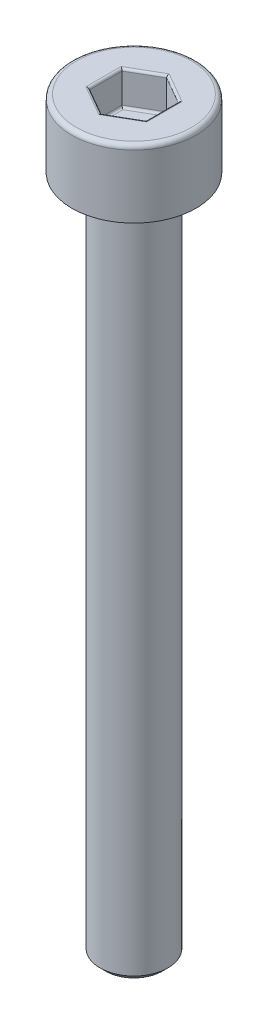
ISO-10303-21;
HEADER;
FILE_DESCRIPTION(('STEP AP214'),'2;1');
FILE_NAME('part.step','',(''),(''),'','','');
FILE_SCHEMA(('AUTOMOTIVE_DESIGN { 1 0 10303 214 1 1 1 1 }'));
ENDSEC;
DATA;
#1=APPLICATION_CONTEXT('core data for automotive mechanical design processes');
#2=APPLICATION_PROTOCOL_DEFINITION('international standard','automotive_design',2000,#1);
#3=PRODUCT_CONTEXT('',#1,'mechanical');
#4=PRODUCT('Part','Part','',(#3));
#5=PRODUCT_RELATED_PRODUCT_CATEGORY('part','',(#4));
#6=PRODUCT_DEFINITION_FORMATION('','',#4);
#7=PRODUCT_DEFINITION_CONTEXT('part definition',#1,'design');
#8=PRODUCT_DEFINITION('design','',#6,#7);
#9=PRODUCT_DEFINITION_SHAPE('','',#8);
#10=(LENGTH_UNIT() NAMED_UNIT(*) SI_UNIT(.MILLI.,.METRE.));
#11=(NAMED_UNIT(*) PLANE_ANGLE_UNIT() SI_UNIT($,.RADIAN.));
#12=(NAMED_UNIT(*) SI_UNIT($,.STERADIAN.) SOLID_ANGLE_UNIT());
#13=UNCERTAINTY_MEASURE_WITH_UNIT(LENGTH_MEASURE(1.E-05),#10,'distance_accuracy_value','');
#14=(GEOMETRIC_REPRESENTATION_CONTEXT(3) GLOBAL_UNCERTAINTY_ASSIGNED_CONTEXT((#13)) GLOBAL_UNIT_ASSIGNED_CONTEXT((#10,
#11,#12)) REPRESENTATION_CONTEXT('',''));
#15=CARTESIAN_POINT('',(0.,0.,0.));
#16=DIRECTION('',(0.,0.,1.));
#17=DIRECTION('',(1.,0.,0.));
#18=AXIS2_PLACEMENT_3D('',#15,#16,#17);
#19=CARTESIAN_POINT('',(0.,-33.,0.));
#20=DIRECTION('',(0.,-1.,0.));
#21=DIRECTION('',(0.,0.,-1.));
#22=AXIS2_PLACEMENT_3D('',#19,#20,#21);
#23=PLANE('',#22);
#24=CARTESIAN_POINT('',(0.,-33.,0.));
#25=DIRECTION('',(0.,-1.,0.));
#26=DIRECTION('',(0.,0.,-1.));
#27=AXIS2_PLACEMENT_3D('',#24,#25,#26);
#28=CIRCLE('',#27,1.25);
#29=CARTESIAN_POINT('',(0.,-33.,-1.25));
#30=VERTEX_POINT('',#29);
#31=EDGE_CURVE('E264',#30,#30,#28,.T.);
#32=ORIENTED_EDGE('',*,*,#31,.T.);
#33=EDGE_LOOP('',(#32));
#34=FACE_BOUND('',#33,.T.);
#35=ADVANCED_FACE('F36',(#34),#23,.T.);
#36=CARTESIAN_POINT('',(0.,0.,0.));
#37=DIRECTION('',(0.,1.,0.));
#38=DIRECTION('',(0.,0.,1.));
#39=AXIS2_PLACEMENT_3D('',#36,#37,#38);
#40=CYLINDRICAL_SURFACE('',#39,1.5);
#41=CARTESIAN_POINT('',(0.,-3.25,0.));
#42=DIRECTION('',(0.,-1.,0.));
#43=DIRECTION('',(0.,0.,-1.));
#44=AXIS2_PLACEMENT_3D('',#41,#42,#43);
#45=CIRCLE('',#44,1.5);
#46=CARTESIAN_POINT('',(0.,-3.25,-1.5));
#47=VERTEX_POINT('',#46);
#48=EDGE_CURVE('E261',#47,#47,#45,.T.);
#49=ORIENTED_EDGE('',*,*,#48,.T.);
#50=EDGE_LOOP('',(#49));
#51=FACE_BOUND('',#50,.T.);
#52=CARTESIAN_POINT('',(0.,-32.75,0.));
#53=DIRECTION('',(0.,-1.,0.));
#54=DIRECTION('',(0.,0.,-1.));
#55=AXIS2_PLACEMENT_3D('',#52,#53,#54);
#56=CIRCLE('',#55,1.5);
#57=CARTESIAN_POINT('',(0.,-32.75,-1.5));
#58=VERTEX_POINT('',#57);
#59=EDGE_CURVE('E258',#58,#58,#56,.F.);
#60=ORIENTED_EDGE('',*,*,#59,.T.);
#61=EDGE_LOOP('',(#60));
#62=FACE_BOUND('',#61,.T.);
#63=ADVANCED_FACE('F290',(#51,#62),#40,.T.);
#64=CARTESIAN_POINT('',(-1.5,-3.,0.));
#65=DIRECTION('',(0.,-1.,0.));
#66=DIRECTION('',(0.,0.,-1.));
#67=AXIS2_PLACEMENT_3D('',#64,#65,#66);
#68=PLANE('',#67);
#69=CARTESIAN_POINT('',(0.,-3.,0.));
#70=DIRECTION('',(0.,-1.,0.));
#71=DIRECTION('',(0.,0.,-1.));
#72=AXIS2_PLACEMENT_3D('',#69,#70,#71);
#73=CIRCLE('',#72,1.74999999999999);
#74=CARTESIAN_POINT('',(0.,-3.,-1.74999999999999));
#75=VERTEX_POINT('',#74);
#76=EDGE_CURVE('E255',#75,#75,#73,.F.);
#77=ORIENTED_EDGE('',*,*,#76,.T.);
#78=EDGE_LOOP('',(#77));
#79=FACE_BOUND('',#78,.T.);
#80=CARTESIAN_POINT('',(0.,-3.,0.));
#81=DIRECTION('',(0.,1.,0.));
#82=DIRECTION('',(0.,0.,1.));
#83=AXIS2_PLACEMENT_3D('',#80,#81,#82);
#84=CIRCLE('',#83,2.75);
#85=CARTESIAN_POINT('',(0.,-3.,2.75));
#86=VERTEX_POINT('',#85);
#87=EDGE_CURVE('E252',#86,#86,#84,.T.);
#88=ORIENTED_EDGE('',*,*,#87,.F.);
#89=EDGE_LOOP('',(#88));
#90=FACE_BOUND('',#89,.T.);
#91=ADVANCED_FACE('F296',(#79,#90),#68,.T.);
#92=CARTESIAN_POINT('',(0.,0.,0.));
#93=DIRECTION('',(0.,1.,0.));
#94=DIRECTION('',(0.,0.,1.));
#95=AXIS2_PLACEMENT_3D('',#92,#93,#94);
#96=CYLINDRICAL_SURFACE('',#95,2.75);
#97=CARTESIAN_POINT('',(0.,-0.2,0.));
#98=DIRECTION('',(0.,1.,0.));
#99=DIRECTION('',(0.,0.,1.));
#100=AXIS2_PLACEMENT_3D('',#97,#98,#99);
#101=CIRCLE('',#100,2.75);
#102=CARTESIAN_POINT('',(0.,-0.2,2.75));
#103=VERTEX_POINT('',#102);
#104=EDGE_CURVE('E162',#103,#103,#101,.F.);
#105=ORIENTED_EDGE('',*,*,#104,.T.);
#106=EDGE_LOOP('',(#105));
#107=FACE_BOUND('',#106,.T.);
#108=ORIENTED_EDGE('',*,*,#87,.T.);
#109=EDGE_LOOP('',(#108));
#110=FACE_BOUND('',#109,.T.);
#111=ADVANCED_FACE('F306',(#107,#110),#96,.T.);
#112=CARTESIAN_POINT('',(-2.75,0.,0.));
#113=DIRECTION('',(0.,1.,0.));
#114=DIRECTION('',(0.,0.,1.));
#115=AXIS2_PLACEMENT_3D('',#112,#113,#114);
#116=PLANE('',#115);
#117=DIRECTION('',(0.,0.,1.));
#118=VECTOR('',#117,1.);
#119=CARTESIAN_POINT('',(-1.35,0.,-0.721687836487034));
#120=LINE('',#119,#118);
#121=CARTESIAN_POINT('',(-1.35,0.,0.779422863405994));
#122=VERTEX_POINT('',#121);
#123=CARTESIAN_POINT('',(-1.35,0.,-0.779422863405996));
#124=VERTEX_POINT('',#123);
#125=EDGE_CURVE('E178',#122,#124,#120,.F.);
#126=ORIENTED_EDGE('',*,*,#125,.T.);
#127=DIRECTION('',(-0.866025403784439,0.,0.5));
#128=VECTOR('',#127,1.);
#129=CARTESIAN_POINT('',(-0.0500000000000009,0.,-1.52997821335251));
#130=LINE('',#129,#128);
#131=CARTESIAN_POINT('',(0.,0.,-1.55884572681199));
#132=VERTEX_POINT('',#131);
#133=EDGE_CURVE('E137',#124,#132,#130,.F.);
#134=ORIENTED_EDGE('',*,*,#133,.T.);
#135=DIRECTION('',(-0.866025403784439,0.,-0.5));
#136=VECTOR('',#135,1.);
#137=CARTESIAN_POINT('',(1.3,0.,-0.808290376865478));
#138=LINE('',#137,#136);
#139=CARTESIAN_POINT('',(1.35,0.,-0.779422863405996));
#140=VERTEX_POINT('',#139);
#141=EDGE_CURVE('E164',#132,#140,#138,.F.);
#142=ORIENTED_EDGE('',*,*,#141,.T.);
#143=DIRECTION('',(0.,0.,-1.));
#144=VECTOR('',#143,1.);
#145=CARTESIAN_POINT('',(1.35,0.,0.721687836487032));
#146=LINE('',#145,#144);
#147=CARTESIAN_POINT('',(1.35,0.,0.779422863405995));
#148=VERTEX_POINT('',#147);
#149=EDGE_CURVE('E172',#140,#148,#146,.F.);
#150=ORIENTED_EDGE('',*,*,#149,.T.);
#151=DIRECTION('',(0.866025403784439,0.,-0.5));
#152=VECTOR('',#151,1.);
#153=CARTESIAN_POINT('',(0.0499999999999991,0.,1.52997821335251));
#154=LINE('',#153,#152);
#155=CARTESIAN_POINT('',(0.,0.,1.55884572681199));
#156=VERTEX_POINT('',#155);
#157=EDGE_CURVE('E174',#148,#156,#154,.F.);
#158=ORIENTED_EDGE('',*,*,#157,.T.);
#159=DIRECTION('',(0.866025403784439,0.,0.5));
#160=VECTOR('',#159,1.);
#161=CARTESIAN_POINT('',(-1.3,0.,0.808290376865476));
#162=LINE('',#161,#160);
#163=EDGE_CURVE('E176',#156,#122,#162,.F.);
#164=ORIENTED_EDGE('',*,*,#163,.T.);
#165=EDGE_LOOP('',(#126,#134,#142,#150,#158,#164));
#166=FACE_BOUND('',#165,.T.);
#167=CARTESIAN_POINT('',(0.,0.,0.));
#168=DIRECTION('',(0.,1.,0.));
#169=DIRECTION('',(0.,0.,1.));
#170=AXIS2_PLACEMENT_3D('',#167,#168,#169);
#171=CIRCLE('',#170,2.55);
#172=CARTESIAN_POINT('',(0.,0.,2.55));
#173=VERTEX_POINT('',#172);
#174=EDGE_CURVE('E167',#173,#173,#171,.T.);
#175=ORIENTED_EDGE('',*,*,#174,.T.);
#176=EDGE_LOOP('',(#175));
#177=FACE_BOUND('',#176,.T.);
#178=ADVANCED_FACE('F269',(#166,#177),#116,.T.);
#179=CARTESIAN_POINT('',(0.,-3.,0.));
#180=DIRECTION('',(0.,1.,0.));
#181=DIRECTION('',(0.,0.,1.));
#182=AXIS2_PLACEMENT_3D('',#179,#180,#181);
#183=CONICAL_SURFACE('',#182,1.74999999999999,0.785398163397452);
#184=ORIENTED_EDGE('',*,*,#48,.F.);
#185=EDGE_LOOP('',(#184));
#186=FACE_BOUND('',#185,.T.);
#187=ORIENTED_EDGE('',*,*,#76,.F.);
#188=EDGE_LOOP('',(#187));
#189=FACE_BOUND('',#188,.T.);
#190=ADVANCED_FACE('F284',(#186,#189),#183,.T.);
#191=CARTESIAN_POINT('',(0.,-32.75,0.));
#192=DIRECTION('',(0.,1.,0.));
#193=DIRECTION('',(0.,0.,1.));
#194=AXIS2_PLACEMENT_3D('',#191,#192,#193);
#195=CONICAL_SURFACE('',#194,1.5,0.785398163397443);
#196=ORIENTED_EDGE('',*,*,#31,.F.);
#197=EDGE_LOOP('',(#196));
#198=FACE_BOUND('',#197,.T.);
#199=ORIENTED_EDGE('',*,*,#59,.F.);
#200=EDGE_LOOP('',(#199));
#201=FACE_BOUND('',#200,.T.);
#202=ADVANCED_FACE('F274',(#198,#201),#195,.T.);
#203=CARTESIAN_POINT('',(0.,-0.2,0.));
#204=DIRECTION('',(0.,1.,0.));
#205=DIRECTION('',(0.,0.,1.));
#206=AXIS2_PLACEMENT_3D('',#203,#204,#205);
#207=TOROIDAL_SURFACE('',#206,2.55,0.2);
#208=ORIENTED_EDGE('',*,*,#104,.F.);
#209=EDGE_LOOP('',(#208));
#210=FACE_BOUND('',#209,.T.);
#211=ORIENTED_EDGE('',*,*,#174,.F.);
#212=EDGE_LOOP('',(#211));
#213=FACE_BOUND('',#212,.T.);
#214=ADVANCED_FACE('F271',(#210,#213),#207,.T.);
#215=CARTESIAN_POINT('',(1.25,-1.5,-0.721687836487034));
#216=DIRECTION('',(0.5,0.,-0.866025403784439));
#217=DIRECTION('',(-0.866025403784439,0.,-0.5));
#218=AXIS2_PLACEMENT_3D('',#215,#216,#217);
#219=PLANE('',#218);
#220=DIRECTION('',(0.,1.,0.));
#221=VECTOR('',#220,1.);
#222=CARTESIAN_POINT('',(1.25,-1.5,-0.721687836487034));
#223=LINE('',#222,#221);
#224=CARTESIAN_POINT('',(1.25,-1.4,-0.721687836487034));
#225=VERTEX_POINT('',#224);
#226=CARTESIAN_POINT('',(1.25,-0.1,-0.721687836487034));
#227=VERTEX_POINT('',#226);
#228=EDGE_CURVE('E246',#225,#227,#223,.T.);
#229=ORIENTED_EDGE('',*,*,#228,.T.);
#230=DIRECTION('',(-0.866025403784439,0.,-0.5));
#231=VECTOR('',#230,1.);
#232=CARTESIAN_POINT('',(0.,-0.1,-1.44337567297407));
#233=LINE('',#232,#231);
#234=CARTESIAN_POINT('',(0.,-0.1,-1.44337567297407));
#235=VERTEX_POINT('',#234);
#236=EDGE_CURVE('E198',#227,#235,#233,.T.);
#237=ORIENTED_EDGE('',*,*,#236,.T.);
#238=DIRECTION('',(0.,1.,0.));
#239=VECTOR('',#238,1.);
#240=CARTESIAN_POINT('',(0.,-1.5,-1.44337567297407));
#241=LINE('',#240,#239);
#242=CARTESIAN_POINT('',(0.,-1.4,-1.44337567297407));
#243=VERTEX_POINT('',#242);
#244=EDGE_CURVE('E148',#243,#235,#241,.T.);
#245=ORIENTED_EDGE('',*,*,#244,.F.);
#246=DIRECTION('',(-0.866025403784439,0.,-0.5));
#247=VECTOR('',#246,1.);
#248=CARTESIAN_POINT('',(1.25,-1.4,-0.721687836487034));
#249=LINE('',#248,#247);
#250=EDGE_CURVE('E196',#243,#225,#249,.F.);
#251=ORIENTED_EDGE('',*,*,#250,.T.);
#252=EDGE_LOOP('',(#229,#237,#245,#251));
#253=FACE_BOUND('',#252,.T.);
#254=ADVANCED_FACE('F273',(#253),#219,.F.);
#255=CARTESIAN_POINT('',(1.25,-1.5,0.721687836487032));
#256=DIRECTION('',(1.,0.,0.));
#257=DIRECTION('',(0.,0.,-1.));
#258=AXIS2_PLACEMENT_3D('',#255,#256,#257);
#259=PLANE('',#258);
#260=DIRECTION('',(0.,1.,0.));
#261=VECTOR('',#260,1.);
#262=CARTESIAN_POINT('',(1.25,-1.5,0.721687836487032));
#263=LINE('',#262,#261);
#264=CARTESIAN_POINT('',(1.25,-1.4,0.721687836487032));
#265=VERTEX_POINT('',#264);
#266=CARTESIAN_POINT('',(1.25,-0.1,0.721687836487032));
#267=VERTEX_POINT('',#266);
#268=EDGE_CURVE('E243',#265,#267,#263,.T.);
#269=ORIENTED_EDGE('',*,*,#268,.T.);
#270=DIRECTION('',(0.,0.,-1.));
#271=VECTOR('',#270,1.);
#272=CARTESIAN_POINT('',(1.25,-0.1,-0.721687836487034));
#273=LINE('',#272,#271);
#274=EDGE_CURVE('E194',#267,#227,#273,.T.);
#275=ORIENTED_EDGE('',*,*,#274,.T.);
#276=ORIENTED_EDGE('',*,*,#228,.F.);
#277=DIRECTION('',(0.,0.,-1.));
#278=VECTOR('',#277,1.);
#279=CARTESIAN_POINT('',(1.25,-1.4,0.721687836487032));
#280=LINE('',#279,#278);
#281=EDGE_CURVE('E191',#225,#265,#280,.F.);
#282=ORIENTED_EDGE('',*,*,#281,.T.);
#283=EDGE_LOOP('',(#269,#275,#276,#282));
#284=FACE_BOUND('',#283,.T.);
#285=ADVANCED_FACE('F281',(#284),#259,.F.);
#286=CARTESIAN_POINT('',(0.,-1.5,1.44337567297406));
#287=DIRECTION('',(0.5,0.,0.866025403784439));
#288=DIRECTION('',(0.866025403784439,0.,-0.5));
#289=AXIS2_PLACEMENT_3D('',#286,#287,#288);
#290=PLANE('',#289);
#291=DIRECTION('',(0.,1.,0.));
#292=VECTOR('',#291,1.);
#293=CARTESIAN_POINT('',(0.,-1.5,1.44337567297406));
#294=LINE('',#293,#292);
#295=CARTESIAN_POINT('',(0.,-1.4,1.44337567297406));
#296=VERTEX_POINT('',#295);
#297=CARTESIAN_POINT('',(0.,-0.1,1.44337567297406));
#298=VERTEX_POINT('',#297);
#299=EDGE_CURVE('E240',#296,#298,#294,.T.);
#300=ORIENTED_EDGE('',*,*,#299,.T.);
#301=DIRECTION('',(0.866025403784439,0.,-0.5));
#302=VECTOR('',#301,1.);
#303=CARTESIAN_POINT('',(1.25,-0.1,0.721687836487032));
#304=LINE('',#303,#302);
#305=EDGE_CURVE('E189',#298,#267,#304,.T.);
#306=ORIENTED_EDGE('',*,*,#305,.T.);
#307=ORIENTED_EDGE('',*,*,#268,.F.);
#308=DIRECTION('',(0.866025403784439,0.,-0.5));
#309=VECTOR('',#308,1.);
#310=CARTESIAN_POINT('',(0.,-1.4,1.44337567297406));
#311=LINE('',#310,#309);
#312=EDGE_CURVE('E187',#265,#296,#311,.F.);
#313=ORIENTED_EDGE('',*,*,#312,.T.);
#314=EDGE_LOOP('',(#300,#306,#307,#313));
#315=FACE_BOUND('',#314,.T.);
#316=ADVANCED_FACE('F330',(#315),#290,.F.);
#317=CARTESIAN_POINT('',(-1.25,-1.5,0.721687836487032));
#318=DIRECTION('',(-0.5,0.,0.866025403784439));
#319=DIRECTION('',(0.866025403784439,0.,0.5));
#320=AXIS2_PLACEMENT_3D('',#317,#318,#319);
#321=PLANE('',#320);
#322=DIRECTION('',(0.,1.,0.));
#323=VECTOR('',#322,1.);
#324=CARTESIAN_POINT('',(-1.25,-1.5,0.721687836487032));
#325=LINE('',#324,#323);
#326=CARTESIAN_POINT('',(-1.25,-1.4,0.721687836487032));
#327=VERTEX_POINT('',#326);
#328=CARTESIAN_POINT('',(-1.25,-0.1,0.721687836487032));
#329=VERTEX_POINT('',#328);
#330=EDGE_CURVE('E131',#327,#329,#325,.T.);
#331=ORIENTED_EDGE('',*,*,#330,.T.);
#332=DIRECTION('',(0.866025403784439,0.,0.5));
#333=VECTOR('',#332,1.);
#334=CARTESIAN_POINT('',(0.,-0.1,1.44337567297406));
#335=LINE('',#334,#333);
#336=EDGE_CURVE('E185',#329,#298,#335,.T.);
#337=ORIENTED_EDGE('',*,*,#336,.T.);
#338=ORIENTED_EDGE('',*,*,#299,.F.);
#339=DIRECTION('',(0.866025403784439,0.,0.5));
#340=VECTOR('',#339,1.);
#341=CARTESIAN_POINT('',(-1.25,-1.4,0.721687836487032));
#342=LINE('',#341,#340);
#343=EDGE_CURVE('E183',#296,#327,#342,.F.);
#344=ORIENTED_EDGE('',*,*,#343,.T.);
#345=EDGE_LOOP('',(#331,#337,#338,#344));
#346=FACE_BOUND('',#345,.T.);
#347=ADVANCED_FACE('F237',(#346),#321,.F.);
#348=CARTESIAN_POINT('',(-1.25,-1.5,-0.721687836487034));
#349=DIRECTION('',(-1.,0.,0.));
#350=DIRECTION('',(0.,0.,1.));
#351=AXIS2_PLACEMENT_3D('',#348,#349,#350);
#352=PLANE('',#351);
#353=DIRECTION('',(0.,1.,0.));
#354=VECTOR('',#353,1.);
#355=CARTESIAN_POINT('',(-1.25,-1.5,-0.721687836487034));
#356=LINE('',#355,#354);
#357=CARTESIAN_POINT('',(-1.25,-1.4,-0.721687836487034));
#358=VERTEX_POINT('',#357);
#359=CARTESIAN_POINT('',(-1.25,-0.1,-0.721687836487034));
#360=VERTEX_POINT('',#359);
#361=EDGE_CURVE('E129',#358,#360,#356,.T.);
#362=ORIENTED_EDGE('',*,*,#361,.T.);
#363=DIRECTION('',(0.,0.,1.));
#364=VECTOR('',#363,1.);
#365=CARTESIAN_POINT('',(-1.25,-0.1,0.721687836487032));
#366=LINE('',#365,#364);
#367=EDGE_CURVE('E136',#360,#329,#366,.T.);
#368=ORIENTED_EDGE('',*,*,#367,.T.);
#369=ORIENTED_EDGE('',*,*,#330,.F.);
#370=DIRECTION('',(0.,0.,1.));
#371=VECTOR('',#370,1.);
#372=CARTESIAN_POINT('',(-1.25,-1.4,-0.721687836487034));
#373=LINE('',#372,#371);
#374=EDGE_CURVE('E126',#327,#358,#373,.F.);
#375=ORIENTED_EDGE('',*,*,#374,.T.);
#376=EDGE_LOOP('',(#362,#368,#369,#375));
#377=FACE_BOUND('',#376,.T.);
#378=ADVANCED_FACE('F128',(#377),#352,.F.);
#379=CARTESIAN_POINT('',(0.,-1.5,-1.44337567297407));
#380=DIRECTION('',(-0.5,0.,-0.866025403784439));
#381=DIRECTION('',(-0.866025403784439,0.,0.5));
#382=AXIS2_PLACEMENT_3D('',#379,#380,#381);
#383=PLANE('',#382);
#384=ORIENTED_EDGE('',*,*,#244,.T.);
#385=DIRECTION('',(-0.866025403784439,0.,0.5));
#386=VECTOR('',#385,1.);
#387=CARTESIAN_POINT('',(-1.25,-0.1,-0.721687836487033));
#388=LINE('',#387,#386);
#389=EDGE_CURVE('E147',#235,#360,#388,.T.);
#390=ORIENTED_EDGE('',*,*,#389,.T.);
#391=ORIENTED_EDGE('',*,*,#361,.F.);
#392=DIRECTION('',(-0.866025403784439,0.,0.5));
#393=VECTOR('',#392,1.);
#394=CARTESIAN_POINT('',(0.,-1.4,-1.44337567297407));
#395=LINE('',#394,#393);
#396=EDGE_CURVE('E144',#358,#243,#395,.F.);
#397=ORIENTED_EDGE('',*,*,#396,.T.);
#398=EDGE_LOOP('',(#384,#390,#391,#397));
#399=FACE_BOUND('',#398,.T.);
#400=ADVANCED_FACE('F142',(#399),#383,.F.);
#401=CARTESIAN_POINT('',(1.25,-1.5,-0.721687836487033));
#402=DIRECTION('',(0.,-1.,0.));
#403=DIRECTION('',(0.,0.,-1.));
#404=AXIS2_PLACEMENT_3D('',#401,#402,#403);
#405=PLANE('',#404);
#406=DIRECTION('',(0.866025403784439,0.,-0.5));
#407=VECTOR('',#406,1.);
#408=CARTESIAN_POINT('',(1.2,-1.5,0.635085296108589));
#409=LINE('',#408,#407);
#410=CARTESIAN_POINT('',(0.,-1.5,1.32790561913614));
#411=VERTEX_POINT('',#410);
#412=CARTESIAN_POINT('',(1.15,-1.5,0.66395280956807));
#413=VERTEX_POINT('',#412);
#414=EDGE_CURVE('E45',#411,#413,#409,.T.);
#415=ORIENTED_EDGE('',*,*,#414,.T.);
#416=DIRECTION('',(0.,0.,-1.));
#417=VECTOR('',#416,1.);
#418=CARTESIAN_POINT('',(1.15,-1.5,-0.721687836487034));
#419=LINE('',#418,#417);
#420=CARTESIAN_POINT('',(1.15,-1.5,-0.663952809568071));
#421=VERTEX_POINT('',#420);
#422=EDGE_CURVE('E11',#413,#421,#419,.T.);
#423=ORIENTED_EDGE('',*,*,#422,.T.);
#424=DIRECTION('',(-0.866025403784439,0.,-0.5));
#425=VECTOR('',#424,1.);
#426=CARTESIAN_POINT('',(-0.050000000000001,-1.5,-1.35677313259562));
#427=LINE('',#426,#425);
#428=CARTESIAN_POINT('',(0.,-1.5,-1.32790561913614));
#429=VERTEX_POINT('',#428);
#430=EDGE_CURVE('E200',#421,#429,#427,.T.);
#431=ORIENTED_EDGE('',*,*,#430,.T.);
#432=DIRECTION('',(-0.866025403784439,0.,0.5));
#433=VECTOR('',#432,1.);
#434=CARTESIAN_POINT('',(-1.2,-1.5,-0.635085296108589));
#435=LINE('',#434,#433);
#436=CARTESIAN_POINT('',(-1.15,-1.5,-0.663952809568071));
#437=VERTEX_POINT('',#436);
#438=EDGE_CURVE('E202',#429,#437,#435,.T.);
#439=ORIENTED_EDGE('',*,*,#438,.T.);
#440=DIRECTION('',(0.,0.,1.));
#441=VECTOR('',#440,1.);
#442=CARTESIAN_POINT('',(-1.15,-1.5,0.721687836487032));
#443=LINE('',#442,#441);
#444=CARTESIAN_POINT('',(-1.15,-1.5,0.66395280956807));
#445=VERTEX_POINT('',#444);
#446=EDGE_CURVE('E153',#437,#445,#443,.T.);
#447=ORIENTED_EDGE('',*,*,#446,.T.);
#448=DIRECTION('',(0.866025403784439,0.,0.5));
#449=VECTOR('',#448,1.);
#450=CARTESIAN_POINT('',(0.049999999999999,-1.5,1.35677313259562));
#451=LINE('',#450,#449);
#452=EDGE_CURVE('E56',#445,#411,#451,.T.);
#453=ORIENTED_EDGE('',*,*,#452,.T.);
#454=EDGE_LOOP('',(#415,#423,#431,#439,#447,#453));
#455=FACE_BOUND('',#454,.T.);
#456=ADVANCED_FACE('F325',(#455),#405,.F.);
#457=CARTESIAN_POINT('',(0.0499999999999991,-0.1,1.52997821335251));
#458=DIRECTION('',(-0.866025403784439,0.,0.5));
#459=DIRECTION('',(0.5,0.,0.866025403784439));
#460=AXIS2_PLACEMENT_3D('',#457,#458,#459);
#461=CYLINDRICAL_SURFACE('',#460,0.1);
#462=CARTESIAN_POINT('',(0.,-0.1,1.55884572681199));
#463=DIRECTION('',(-1.,0.,0.));
#464=DIRECTION('',(0.,0.,-1.));
#465=AXIS2_PLACEMENT_3D('',#462,#463,#464);
#466=ELLIPSE('',#465,0.115470053837925,0.1);
#467=EDGE_CURVE('E217',#156,#298,#466,.T.);
#468=ORIENTED_EDGE('',*,*,#467,.F.);
#469=ORIENTED_EDGE('',*,*,#157,.F.);
#470=CARTESIAN_POINT('',(1.35,-0.1,0.779422863405995));
#471=DIRECTION('',(-0.5,0.,0.866025403784439));
#472=DIRECTION('',(-0.866025403784439,0.,-0.5));
#473=AXIS2_PLACEMENT_3D('',#470,#471,#472);
#474=ELLIPSE('',#473,0.115470053837925,0.1);
#475=EDGE_CURVE('E220',#267,#148,#474,.F.);
#476=ORIENTED_EDGE('',*,*,#475,.F.);
#477=ORIENTED_EDGE('',*,*,#305,.F.);
#478=EDGE_LOOP('',(#468,#469,#476,#477));
#479=FACE_BOUND('',#478,.T.);
#480=ADVANCED_FACE('F337',(#479),#461,.T.);
#481=CARTESIAN_POINT('',(1.35,-0.1,0.721687836487032));
#482=DIRECTION('',(0.,0.,1.));
#483=DIRECTION('',(1.,0.,0.));
#484=AXIS2_PLACEMENT_3D('',#481,#482,#483);
#485=CYLINDRICAL_SURFACE('',#484,0.1);
#486=ORIENTED_EDGE('',*,*,#475,.T.);
#487=ORIENTED_EDGE('',*,*,#149,.F.);
#488=CARTESIAN_POINT('',(1.35,-0.1,-0.779422863405996));
#489=DIRECTION('',(0.5,0.,0.866025403784439));
#490=DIRECTION('',(-0.866025403784439,0.,0.5));
#491=AXIS2_PLACEMENT_3D('',#488,#489,#490);
#492=ELLIPSE('',#491,0.115470053837925,0.1);
#493=EDGE_CURVE('E214',#227,#140,#492,.F.);
#494=ORIENTED_EDGE('',*,*,#493,.F.);
#495=ORIENTED_EDGE('',*,*,#274,.F.);
#496=EDGE_LOOP('',(#486,#487,#494,#495));
#497=FACE_BOUND('',#496,.T.);
#498=ADVANCED_FACE('F341',(#497),#485,.T.);
#499=CARTESIAN_POINT('',(-1.3,-0.1,0.808290376865476));
#500=DIRECTION('',(-0.866025403784439,0.,-0.5));
#501=DIRECTION('',(-0.5,0.,0.866025403784439));
#502=AXIS2_PLACEMENT_3D('',#499,#500,#501);
#503=CYLINDRICAL_SURFACE('',#502,0.1);
#504=ORIENTED_EDGE('',*,*,#467,.T.);
#505=ORIENTED_EDGE('',*,*,#336,.F.);
#506=CARTESIAN_POINT('',(-1.35,-0.1,0.779422863405994));
#507=DIRECTION('',(-0.5,0.,-0.866025403784439));
#508=DIRECTION('',(0.866025403784439,0.,-0.5));
#509=AXIS2_PLACEMENT_3D('',#506,#507,#508);
#510=ELLIPSE('',#509,0.115470053837925,0.1);
#511=EDGE_CURVE('E211',#122,#329,#510,.T.);
#512=ORIENTED_EDGE('',*,*,#511,.F.);
#513=ORIENTED_EDGE('',*,*,#163,.F.);
#514=EDGE_LOOP('',(#504,#505,#512,#513));
#515=FACE_BOUND('',#514,.T.);
#516=ADVANCED_FACE('F347',(#515),#503,.T.);
#517=CARTESIAN_POINT('',(1.3,-0.1,-0.808290376865478));
#518=DIRECTION('',(0.866025403784439,0.,0.5));
#519=DIRECTION('',(0.5,0.,-0.866025403784439));
#520=AXIS2_PLACEMENT_3D('',#517,#518,#519);
#521=CYLINDRICAL_SURFACE('',#520,0.1);
#522=ORIENTED_EDGE('',*,*,#493,.T.);
#523=ORIENTED_EDGE('',*,*,#141,.F.);
#524=CARTESIAN_POINT('',(0.,-0.1,-1.55884572681199));
#525=DIRECTION('',(1.,0.,0.));
#526=DIRECTION('',(0.,0.,-1.));
#527=AXIS2_PLACEMENT_3D('',#524,#525,#526);
#528=ELLIPSE('',#527,0.115470053837925,0.1);
#529=EDGE_CURVE('E209',#235,#132,#528,.F.);
#530=ORIENTED_EDGE('',*,*,#529,.F.);
#531=ORIENTED_EDGE('',*,*,#236,.F.);
#532=EDGE_LOOP('',(#522,#523,#530,#531));
#533=FACE_BOUND('',#532,.T.);
#534=ADVANCED_FACE('F377',(#533),#521,.T.);
#535=CARTESIAN_POINT('',(-1.35,-0.1,-0.721687836487034));
#536=DIRECTION('',(0.,0.,-1.));
#537=DIRECTION('',(-1.,0.,0.));
#538=AXIS2_PLACEMENT_3D('',#535,#536,#537);
#539=CYLINDRICAL_SURFACE('',#538,0.1);
#540=ORIENTED_EDGE('',*,*,#511,.T.);
#541=ORIENTED_EDGE('',*,*,#367,.F.);
#542=CARTESIAN_POINT('',(-1.35,-0.1,-0.779422863405996));
#543=DIRECTION('',(0.5,0.,-0.866025403784439));
#544=DIRECTION('',(0.866025403784439,0.,0.5));
#545=AXIS2_PLACEMENT_3D('',#542,#543,#544);
#546=ELLIPSE('',#545,0.115470053837925,0.1);
#547=EDGE_CURVE('E207',#124,#360,#546,.T.);
#548=ORIENTED_EDGE('',*,*,#547,.F.);
#549=ORIENTED_EDGE('',*,*,#125,.F.);
#550=EDGE_LOOP('',(#540,#541,#548,#549));
#551=FACE_BOUND('',#550,.T.);
#552=ADVANCED_FACE('F372',(#551),#539,.T.);
#553=CARTESIAN_POINT('',(-0.0500000000000009,-0.1,-1.52997821335251));
#554=DIRECTION('',(0.866025403784439,0.,-0.5));
#555=DIRECTION('',(-0.5,0.,-0.866025403784439));
#556=AXIS2_PLACEMENT_3D('',#553,#554,#555);
#557=CYLINDRICAL_SURFACE('',#556,0.1);
#558=ORIENTED_EDGE('',*,*,#529,.T.);
#559=ORIENTED_EDGE('',*,*,#133,.F.);
#560=ORIENTED_EDGE('',*,*,#547,.T.);
#561=ORIENTED_EDGE('',*,*,#389,.F.);
#562=EDGE_LOOP('',(#558,#559,#560,#561));
#563=FACE_BOUND('',#562,.T.);
#564=ADVANCED_FACE('F368',(#563),#557,.T.);
#565=CARTESIAN_POINT('',(-1.15,-1.4,-0.721687836487033));
#566=DIRECTION('',(0.,0.,-1.));
#567=DIRECTION('',(-1.,0.,0.));
#568=AXIS2_PLACEMENT_3D('',#565,#566,#567);
#569=CYLINDRICAL_SURFACE('',#568,0.1);
#570=CARTESIAN_POINT('',(-1.15,-1.4,-0.663952809568071));
#571=DIRECTION('',(0.5,0.,-0.866025403784439));
#572=DIRECTION('',(-0.866025403784439,0.,-0.5));
#573=AXIS2_PLACEMENT_3D('',#570,#571,#572);
#574=ELLIPSE('',#573,0.115470053837925,0.1);
#575=EDGE_CURVE('E152',#358,#437,#574,.F.);
#576=ORIENTED_EDGE('',*,*,#575,.F.);
#577=ORIENTED_EDGE('',*,*,#374,.F.);
#578=CARTESIAN_POINT('',(-1.15,-1.4,0.66395280956807));
#579=DIRECTION('',(-0.5,0.,-0.866025403784439));
#580=DIRECTION('',(-0.866025403784439,0.,0.5));
#581=AXIS2_PLACEMENT_3D('',#578,#579,#580);
#582=ELLIPSE('',#581,0.115470053837925,0.1);
#583=EDGE_CURVE('E40',#445,#327,#582,.T.);
#584=ORIENTED_EDGE('',*,*,#583,.F.);
#585=ORIENTED_EDGE('',*,*,#446,.F.);
#586=EDGE_LOOP('',(#576,#577,#584,#585));
#587=FACE_BOUND('',#586,.T.);
#588=ADVANCED_FACE('F38',(#587),#569,.F.);
#589=CARTESIAN_POINT('',(0.0499999999999984,-1.4,1.35677313259562));
#590=DIRECTION('',(-0.866025403784439,0.,-0.5));
#591=DIRECTION('',(-0.5,0.,0.866025403784439));
#592=AXIS2_PLACEMENT_3D('',#589,#590,#591);
#593=CYLINDRICAL_SURFACE('',#592,0.1);
#594=ORIENTED_EDGE('',*,*,#583,.T.);
#595=ORIENTED_EDGE('',*,*,#343,.F.);
#596=CARTESIAN_POINT('',(0.,-1.4,1.32790561913614));
#597=DIRECTION('',(-1.,0.,0.));
#598=DIRECTION('',(0.,0.,1.));
#599=AXIS2_PLACEMENT_3D('',#596,#597,#598);
#600=ELLIPSE('',#599,0.115470053837925,0.1);
#601=EDGE_CURVE('E156',#411,#296,#600,.T.);
#602=ORIENTED_EDGE('',*,*,#601,.F.);
#603=ORIENTED_EDGE('',*,*,#452,.F.);
#604=EDGE_LOOP('',(#594,#595,#602,#603));
#605=FACE_BOUND('',#604,.T.);
#606=ADVANCED_FACE('F234',(#605),#593,.F.);
#607=CARTESIAN_POINT('',(0.674999999999999,-1.4,-1.71761705083914));
#608=DIRECTION('',(0.866025403784439,0.,-0.5));
#609=DIRECTION('',(-0.5,0.,-0.866025403784439));
#610=AXIS2_PLACEMENT_3D('',#607,#608,#609);
#611=CYLINDRICAL_SURFACE('',#610,0.1);
#612=ORIENTED_EDGE('',*,*,#575,.T.);
#613=ORIENTED_EDGE('',*,*,#438,.F.);
#614=CARTESIAN_POINT('',(0.,-1.4,-1.32790561913614));
#615=DIRECTION('',(1.,0.,0.));
#616=DIRECTION('',(0.,0.,-1.));
#617=AXIS2_PLACEMENT_3D('',#614,#615,#616);
#618=ELLIPSE('',#617,0.115470053837925,0.1);
#619=EDGE_CURVE('E160',#243,#429,#618,.F.);
#620=ORIENTED_EDGE('',*,*,#619,.F.);
#621=ORIENTED_EDGE('',*,*,#396,.F.);
#622=EDGE_LOOP('',(#612,#613,#620,#621));
#623=FACE_BOUND('',#622,.T.);
#624=ADVANCED_FACE('F158',(#623),#611,.F.);
#625=CARTESIAN_POINT('',(1.825,-1.4,0.274241377865073));
#626=DIRECTION('',(-0.866025403784439,0.,0.5));
#627=DIRECTION('',(0.5,0.,0.866025403784439));
#628=AXIS2_PLACEMENT_3D('',#625,#626,#627);
#629=CYLINDRICAL_SURFACE('',#628,0.1);
#630=ORIENTED_EDGE('',*,*,#601,.T.);
#631=ORIENTED_EDGE('',*,*,#312,.F.);
#632=CARTESIAN_POINT('',(1.15,-1.4,0.66395280956807));
#633=DIRECTION('',(-0.5,0.,0.866025403784439));
#634=DIRECTION('',(0.866025403784439,0.,0.5));
#635=AXIS2_PLACEMENT_3D('',#632,#633,#634);
#636=ELLIPSE('',#635,0.115470053837925,0.1);
#637=EDGE_CURVE('E225',#413,#265,#636,.T.);
#638=ORIENTED_EDGE('',*,*,#637,.F.);
#639=ORIENTED_EDGE('',*,*,#414,.F.);
#640=EDGE_LOOP('',(#630,#631,#638,#639));
#641=FACE_BOUND('',#640,.T.);
#642=ADVANCED_FACE('F231',(#641),#629,.F.);
#643=CARTESIAN_POINT('',(1.2,-1.4,-0.63508529610859));
#644=DIRECTION('',(0.866025403784439,0.,0.5));
#645=DIRECTION('',(0.5,0.,-0.866025403784439));
#646=AXIS2_PLACEMENT_3D('',#643,#644,#645);
#647=CYLINDRICAL_SURFACE('',#646,0.1);
#648=ORIENTED_EDGE('',*,*,#619,.T.);
#649=ORIENTED_EDGE('',*,*,#430,.F.);
#650=CARTESIAN_POINT('',(1.15,-1.4,-0.663952809568071));
#651=DIRECTION('',(0.5,0.,0.866025403784439));
#652=DIRECTION('',(-0.866025403784439,0.,0.5));
#653=AXIS2_PLACEMENT_3D('',#650,#651,#652);
#654=ELLIPSE('',#653,0.115470053837925,0.1);
#655=EDGE_CURVE('E223',#225,#421,#654,.F.);
#656=ORIENTED_EDGE('',*,*,#655,.F.);
#657=ORIENTED_EDGE('',*,*,#250,.F.);
#658=EDGE_LOOP('',(#648,#649,#656,#657));
#659=FACE_BOUND('',#658,.T.);
#660=ADVANCED_FACE('F356',(#659),#647,.F.);
#661=CARTESIAN_POINT('',(1.15,-1.4,-0.721687836487033));
#662=DIRECTION('',(0.,0.,1.));
#663=DIRECTION('',(1.,0.,0.));
#664=AXIS2_PLACEMENT_3D('',#661,#662,#663);
#665=CYLINDRICAL_SURFACE('',#664,0.1);
#666=ORIENTED_EDGE('',*,*,#637,.T.);
#667=ORIENTED_EDGE('',*,*,#281,.F.);
#668=ORIENTED_EDGE('',*,*,#655,.T.);
#669=ORIENTED_EDGE('',*,*,#422,.F.);
#670=EDGE_LOOP('',(#666,#667,#668,#669));
#671=FACE_BOUND('',#670,.T.);
#672=ADVANCED_FACE('F353',(#671),#665,.F.);
#673=CLOSED_SHELL('',(#35,#63,#91,#111,#178,#190,#202,#214,#254,#285,#316,#347,#378,#400,#456,
#480,#498,#516,#534,#552,#564,#588,#606,#624,#642,#660,#672));
#674=MANIFOLD_SOLID_BREP('B2',#673);
#675=ADVANCED_BREP_SHAPE_REPRESENTATION('',(#18,#674),#14);
#676=SHAPE_DEFINITION_REPRESENTATION(#9,#675);
ENDSEC;
END-ISO-10303-21;
